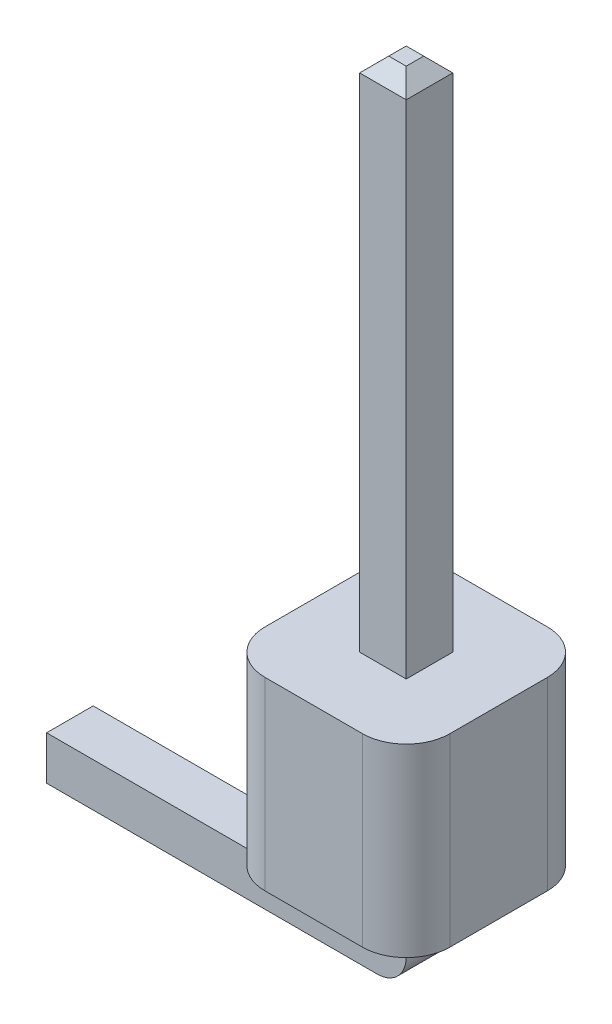
ISO-10303-21;
HEADER;
FILE_DESCRIPTION(('STEP AP214'),'2;1');
FILE_NAME('part.step','',(''),(''),'','','');
FILE_SCHEMA(('AUTOMOTIVE_DESIGN { 1 0 10303 214 1 1 1 1 }'));
ENDSEC;
DATA;
#1=APPLICATION_CONTEXT('core data for automotive mechanical design processes');
#2=APPLICATION_PROTOCOL_DEFINITION('international standard','automotive_design',2000,#1);
#3=PRODUCT_CONTEXT('',#1,'mechanical');
#4=PRODUCT('Part','Part','',(#3));
#5=PRODUCT_RELATED_PRODUCT_CATEGORY('part','',(#4));
#6=PRODUCT_DEFINITION_FORMATION('','',#4);
#7=PRODUCT_DEFINITION_CONTEXT('part definition',#1,'design');
#8=PRODUCT_DEFINITION('design','',#6,#7);
#9=PRODUCT_DEFINITION_SHAPE('','',#8);
#10=(LENGTH_UNIT() NAMED_UNIT(*) SI_UNIT(.MILLI.,.METRE.));
#11=(NAMED_UNIT(*) PLANE_ANGLE_UNIT() SI_UNIT($,.RADIAN.));
#12=(NAMED_UNIT(*) SI_UNIT($,.STERADIAN.) SOLID_ANGLE_UNIT());
#13=UNCERTAINTY_MEASURE_WITH_UNIT(LENGTH_MEASURE(1.E-05),#10,'distance_accuracy_value','');
#14=(GEOMETRIC_REPRESENTATION_CONTEXT(3) GLOBAL_UNCERTAINTY_ASSIGNED_CONTEXT((#13)) GLOBAL_UNIT_ASSIGNED_CONTEXT((#10,
#11,#12)) REPRESENTATION_CONTEXT('',''));
#15=CARTESIAN_POINT('',(0.,0.,0.));
#16=DIRECTION('',(0.,0.,1.));
#17=DIRECTION('',(1.,0.,0.));
#18=AXIS2_PLACEMENT_3D('',#15,#16,#17);
#19=CARTESIAN_POINT('',(-1.05381363281178,2.54,-1.51128201849815));
#20=DIRECTION('',(1.,0.,0.));
#21=DIRECTION('',(0.,0.,-1.));
#22=AXIS2_PLACEMENT_3D('',#19,#20,#21);
#23=PLANE('',#22);
#24=DIRECTION('',(0.,0.,1.));
#25=VECTOR('',#24,1.);
#26=CARTESIAN_POINT('',(-1.05381363281178,0.,-1.51128201849815));
#27=LINE('',#26,#25);
#28=CARTESIAN_POINT('',(-1.05381363281178,0.,-0.91128201849815));
#29=VERTEX_POINT('',#28);
#30=CARTESIAN_POINT('',(-1.05381363281178,0.,0.428717981501851));
#31=VERTEX_POINT('',#30);
#32=EDGE_CURVE('P0_E145',#29,#31,#27,.T.);
#33=ORIENTED_EDGE('',*,*,#32,.T.);
#34=DIRECTION('',(0.,-1.,0.));
#35=VECTOR('',#34,1.);
#36=CARTESIAN_POINT('',(-1.05381363281178,2.54,0.428717981501851));
#37=LINE('',#36,#35);
#38=CARTESIAN_POINT('',(-1.05381363281178,2.54,0.428717981501851));
#39=VERTEX_POINT('',#38);
#40=EDGE_CURVE('P0_E184',#31,#39,#37,.F.);
#41=ORIENTED_EDGE('',*,*,#40,.T.);
#42=DIRECTION('',(0.,0.,1.));
#43=VECTOR('',#42,1.);
#44=CARTESIAN_POINT('',(-1.05381363281178,2.54,-1.51128201849815));
#45=LINE('',#44,#43);
#46=CARTESIAN_POINT('',(-1.05381363281178,2.54,-0.91128201849815));
#47=VERTEX_POINT('',#46);
#48=EDGE_CURVE('P0_E149',#47,#39,#45,.T.);
#49=ORIENTED_EDGE('',*,*,#48,.F.);
#50=DIRECTION('',(0.,-1.,0.));
#51=VECTOR('',#50,1.);
#52=CARTESIAN_POINT('',(-1.05381363281178,2.54,-0.91128201849815));
#53=LINE('',#52,#51);
#54=EDGE_CURVE('P0_E160',#47,#29,#53,.T.);
#55=ORIENTED_EDGE('',*,*,#54,.T.);
#56=EDGE_LOOP('',(#33,#41,#49,#55));
#57=FACE_BOUND('',#56,.T.);
#58=ADVANCED_FACE('P0_F17',(#57),#23,.F.);
#59=CARTESIAN_POINT('',(-1.05381363281178,2.54,1.02871798150185));
#60=DIRECTION('',(0.,0.,-1.));
#61=DIRECTION('',(-1.,0.,0.));
#62=AXIS2_PLACEMENT_3D('',#59,#60,#61);
#63=PLANE('',#62);
#64=DIRECTION('',(1.,0.,0.));
#65=VECTOR('',#64,1.);
#66=CARTESIAN_POINT('',(-1.05381363281178,0.,1.02871798150185));
#67=LINE('',#66,#65);
#68=CARTESIAN_POINT('',(-0.453813632811776,0.,1.02871798150185));
#69=VERTEX_POINT('',#68);
#70=CARTESIAN_POINT('',(0.886186367188225,0.,1.02871798150185));
#71=VERTEX_POINT('',#70);
#72=EDGE_CURVE('P0_E163',#69,#71,#67,.T.);
#73=ORIENTED_EDGE('',*,*,#72,.T.);
#74=DIRECTION('',(0.,-1.,0.));
#75=VECTOR('',#74,1.);
#76=CARTESIAN_POINT('',(0.886186367188225,2.54,1.02871798150185));
#77=LINE('',#76,#75);
#78=CARTESIAN_POINT('',(0.886186367188225,2.54,1.02871798150185));
#79=VERTEX_POINT('',#78);
#80=EDGE_CURVE('P0_E193',#71,#79,#77,.F.);
#81=ORIENTED_EDGE('',*,*,#80,.T.);
#82=DIRECTION('',(1.,0.,0.));
#83=VECTOR('',#82,1.);
#84=CARTESIAN_POINT('',(-1.05381363281178,2.54,1.02871798150185));
#85=LINE('',#84,#83);
#86=CARTESIAN_POINT('',(-0.453813632811776,2.54,1.02871798150185));
#87=VERTEX_POINT('',#86);
#88=EDGE_CURVE('P0_E152',#87,#79,#85,.T.);
#89=ORIENTED_EDGE('',*,*,#88,.F.);
#90=DIRECTION('',(0.,-1.,0.));
#91=VECTOR('',#90,1.);
#92=CARTESIAN_POINT('',(-0.453813632811776,2.54,1.02871798150185));
#93=LINE('',#92,#91);
#94=EDGE_CURVE('P0_E179',#87,#69,#93,.T.);
#95=ORIENTED_EDGE('',*,*,#94,.T.);
#96=EDGE_LOOP('',(#73,#81,#89,#95));
#97=FACE_BOUND('',#96,.T.);
#98=ADVANCED_FACE('P0_F224',(#97),#63,.F.);
#99=CARTESIAN_POINT('',(1.48618636718822,2.54,-1.51128201849815));
#100=DIRECTION('',(-1.,0.,0.));
#101=DIRECTION('',(0.,0.,1.));
#102=AXIS2_PLACEMENT_3D('',#99,#100,#101);
#103=PLANE('',#102);
#104=DIRECTION('',(0.,0.,-1.));
#105=VECTOR('',#104,1.);
#106=CARTESIAN_POINT('',(1.48618636718822,0.,-1.51128201849815));
#107=LINE('',#106,#105);
#108=CARTESIAN_POINT('',(1.48618636718822,0.,0.428717981501851));
#109=VERTEX_POINT('',#108);
#110=CARTESIAN_POINT('',(1.48618636718822,0.,-0.91128201849815));
#111=VERTEX_POINT('',#110);
#112=EDGE_CURVE('P0_E166',#109,#111,#107,.T.);
#113=ORIENTED_EDGE('',*,*,#112,.T.);
#114=DIRECTION('',(0.,-1.,0.));
#115=VECTOR('',#114,1.);
#116=CARTESIAN_POINT('',(1.48618636718822,2.54,-0.91128201849815));
#117=LINE('',#116,#115);
#118=CARTESIAN_POINT('',(1.48618636718822,2.54,-0.91128201849815));
#119=VERTEX_POINT('',#118);
#120=EDGE_CURVE('P0_E25',#111,#119,#117,.F.);
#121=ORIENTED_EDGE('',*,*,#120,.T.);
#122=DIRECTION('',(0.,0.,-1.));
#123=VECTOR('',#122,1.);
#124=CARTESIAN_POINT('',(1.48618636718822,2.54,-1.51128201849815));
#125=LINE('',#124,#123);
#126=CARTESIAN_POINT('',(1.48618636718822,2.54,0.428717981501851));
#127=VERTEX_POINT('',#126);
#128=EDGE_CURVE('P0_E156',#127,#119,#125,.T.);
#129=ORIENTED_EDGE('',*,*,#128,.F.);
#130=DIRECTION('',(0.,-1.,0.));
#131=VECTOR('',#130,1.);
#132=CARTESIAN_POINT('',(1.48618636718822,2.54,0.428717981501851));
#133=LINE('',#132,#131);
#134=EDGE_CURVE('P0_E188',#127,#109,#133,.T.);
#135=ORIENTED_EDGE('',*,*,#134,.T.);
#136=EDGE_LOOP('',(#113,#121,#129,#135));
#137=FACE_BOUND('',#136,.T.);
#138=ADVANCED_FACE('P0_F230',(#137),#103,.F.);
#139=CARTESIAN_POINT('',(-1.05381363281178,2.54,-1.51128201849815));
#140=DIRECTION('',(0.,0.,1.));
#141=DIRECTION('',(1.,0.,0.));
#142=AXIS2_PLACEMENT_3D('',#139,#140,#141);
#143=PLANE('',#142);
#144=DIRECTION('',(-1.,0.,0.));
#145=VECTOR('',#144,1.);
#146=CARTESIAN_POINT('',(-1.05381363281178,2.54,-1.51128201849815));
#147=LINE('',#146,#145);
#148=CARTESIAN_POINT('',(0.886186367188225,2.54,-1.51128201849815));
#149=VERTEX_POINT('',#148);
#150=CARTESIAN_POINT('',(-0.453813632811776,2.54,-1.51128201849815));
#151=VERTEX_POINT('',#150);
#152=EDGE_CURVE('P0_E158',#149,#151,#147,.T.);
#153=ORIENTED_EDGE('',*,*,#152,.F.);
#154=DIRECTION('',(0.,-1.,0.));
#155=VECTOR('',#154,1.);
#156=CARTESIAN_POINT('',(0.886186367188225,2.54,-1.51128201849815));
#157=LINE('',#156,#155);
#158=CARTESIAN_POINT('',(0.886186367188225,0.,-1.51128201849815));
#159=VERTEX_POINT('',#158);
#160=EDGE_CURVE('P0_E197',#149,#159,#157,.T.);
#161=ORIENTED_EDGE('',*,*,#160,.T.);
#162=DIRECTION('',(-1.,0.,0.));
#163=VECTOR('',#162,1.);
#164=CARTESIAN_POINT('',(-1.05381363281178,0.,-1.51128201849815));
#165=LINE('',#164,#163);
#166=CARTESIAN_POINT('',(-0.453813632811776,0.,-1.51128201849815));
#167=VERTEX_POINT('',#166);
#168=EDGE_CURVE('P0_E153',#159,#167,#165,.T.);
#169=ORIENTED_EDGE('',*,*,#168,.T.);
#170=DIRECTION('',(0.,-1.,0.));
#171=VECTOR('',#170,1.);
#172=CARTESIAN_POINT('',(-0.453813632811776,2.54,-1.51128201849815));
#173=LINE('',#172,#171);
#174=EDGE_CURVE('P0_E174',#167,#151,#173,.F.);
#175=ORIENTED_EDGE('',*,*,#174,.T.);
#176=EDGE_LOOP('',(#153,#161,#169,#175));
#177=FACE_BOUND('',#176,.T.);
#178=ADVANCED_FACE('P0_F203',(#177),#143,.F.);
#179=CARTESIAN_POINT('',(0.,2.54,0.));
#180=DIRECTION('',(0.,1.,0.));
#181=DIRECTION('',(0.,0.,1.));
#182=AXIS2_PLACEMENT_3D('',#179,#180,#181);
#183=PLANE('',#182);
#184=DIRECTION('',(0.,0.,-1.));
#185=VECTOR('',#184,1.);
#186=CARTESIAN_POINT('',(0.536186367188225,2.54,0.0787179815018502));
#187=LINE('',#186,#185);
#188=CARTESIAN_POINT('',(0.536186367188225,2.54,0.0787179815018502));
#189=VERTEX_POINT('',#188);
#190=CARTESIAN_POINT('',(0.536186367188225,2.54,-0.56128201849815));
#191=VERTEX_POINT('',#190);
#192=EDGE_CURVE('P0_E113',#189,#191,#187,.T.);
#193=ORIENTED_EDGE('',*,*,#192,.F.);
#194=DIRECTION('',(1.,0.,0.));
#195=VECTOR('',#194,1.);
#196=CARTESIAN_POINT('',(-0.103813632811776,2.54,0.0787179815018502));
#197=LINE('',#196,#195);
#198=CARTESIAN_POINT('',(-0.103813632811776,2.54,0.0787179815018502));
#199=VERTEX_POINT('',#198);
#200=EDGE_CURVE('P0_E130',#199,#189,#197,.T.);
#201=ORIENTED_EDGE('',*,*,#200,.F.);
#202=DIRECTION('',(0.,0.,1.));
#203=VECTOR('',#202,1.);
#204=CARTESIAN_POINT('',(-0.103813632811776,2.54,0.0787179815018502));
#205=LINE('',#204,#203);
#206=CARTESIAN_POINT('',(-0.103813632811776,2.54,-0.56128201849815));
#207=VERTEX_POINT('',#206);
#208=EDGE_CURVE('P0_E133',#207,#199,#205,.T.);
#209=ORIENTED_EDGE('',*,*,#208,.F.);
#210=DIRECTION('',(-1.,0.,0.));
#211=VECTOR('',#210,1.);
#212=CARTESIAN_POINT('',(-0.103813632811776,2.54,-0.56128201849815));
#213=LINE('',#212,#211);
#214=EDGE_CURVE('P0_E139',#191,#207,#213,.T.);
#215=ORIENTED_EDGE('',*,*,#214,.F.);
#216=EDGE_LOOP('',(#193,#201,#209,#215));
#217=FACE_BOUND('',#216,.T.);
#218=ORIENTED_EDGE('',*,*,#128,.T.);
#219=CARTESIAN_POINT('',(0.886186367188225,2.54,-0.91128201849815));
#220=DIRECTION('',(0.,1.,0.));
#221=DIRECTION('',(0.,0.,1.));
#222=AXIS2_PLACEMENT_3D('',#219,#220,#221);
#223=CIRCLE('',#222,0.6);
#224=EDGE_CURVE('P0_E11',#119,#149,#223,.T.);
#225=ORIENTED_EDGE('',*,*,#224,.T.);
#226=ORIENTED_EDGE('',*,*,#152,.T.);
#227=CARTESIAN_POINT('',(-0.453813632811776,2.54,-0.91128201849815));
#228=DIRECTION('',(0.,1.,0.));
#229=DIRECTION('',(0.,0.,1.));
#230=AXIS2_PLACEMENT_3D('',#227,#228,#229);
#231=CIRCLE('',#230,0.6);
#232=EDGE_CURVE('P0_E177',#151,#47,#231,.T.);
#233=ORIENTED_EDGE('',*,*,#232,.T.);
#234=ORIENTED_EDGE('',*,*,#48,.T.);
#235=CARTESIAN_POINT('',(-0.453813632811776,2.54,0.428717981501851));
#236=DIRECTION('',(0.,1.,0.));
#237=DIRECTION('',(0.,0.,1.));
#238=AXIS2_PLACEMENT_3D('',#235,#236,#237);
#239=CIRCLE('',#238,0.6);
#240=EDGE_CURVE('P0_E186',#39,#87,#239,.T.);
#241=ORIENTED_EDGE('',*,*,#240,.T.);
#242=ORIENTED_EDGE('',*,*,#88,.T.);
#243=CARTESIAN_POINT('',(0.886186367188225,2.54,0.428717981501851));
#244=DIRECTION('',(0.,1.,0.));
#245=DIRECTION('',(0.,0.,1.));
#246=AXIS2_PLACEMENT_3D('',#243,#244,#245);
#247=CIRCLE('',#246,0.6);
#248=EDGE_CURVE('P0_E195',#79,#127,#247,.T.);
#249=ORIENTED_EDGE('',*,*,#248,.T.);
#250=EDGE_LOOP('',(#218,#225,#226,#233,#234,#241,#242,#249));
#251=FACE_BOUND('',#250,.T.);
#252=ADVANCED_FACE('P0_F214',(#217,#251),#183,.T.);
#253=CARTESIAN_POINT('',(0.,0.,0.));
#254=DIRECTION('',(0.,1.,0.));
#255=DIRECTION('',(0.,0.,1.));
#256=AXIS2_PLACEMENT_3D('',#253,#254,#255);
#257=PLANE('',#256);
#258=DIRECTION('',(1.,0.,0.));
#259=VECTOR('',#258,1.);
#260=CARTESIAN_POINT('',(-0.103813632811776,0.,0.0787179815018502));
#261=LINE('',#260,#259);
#262=CARTESIAN_POINT('',(-0.103813632811776,0.,0.0787179815018502));
#263=VERTEX_POINT('',#262);
#264=CARTESIAN_POINT('',(0.536186367188225,0.,0.0787179815018502));
#265=VERTEX_POINT('',#264);
#266=EDGE_CURVE('P0_E118',#263,#265,#261,.T.);
#267=ORIENTED_EDGE('',*,*,#266,.T.);
#268=DIRECTION('',(0.,0.,-1.));
#269=VECTOR('',#268,1.);
#270=CARTESIAN_POINT('',(0.536186367188225,0.,0.0787179815018502));
#271=LINE('',#270,#269);
#272=CARTESIAN_POINT('',(0.536186367188225,0.,-0.56128201849815));
#273=VERTEX_POINT('',#272);
#274=EDGE_CURVE('P0_E110',#265,#273,#271,.T.);
#275=ORIENTED_EDGE('',*,*,#274,.T.);
#276=DIRECTION('',(-1.,0.,0.));
#277=VECTOR('',#276,1.);
#278=CARTESIAN_POINT('',(-0.103813632811776,0.,-0.56128201849815));
#279=LINE('',#278,#277);
#280=CARTESIAN_POINT('',(-0.103813632811776,0.,-0.56128201849815));
#281=VERTEX_POINT('',#280);
#282=EDGE_CURVE('P0_E122',#273,#281,#279,.T.);
#283=ORIENTED_EDGE('',*,*,#282,.T.);
#284=DIRECTION('',(0.,0.,1.));
#285=VECTOR('',#284,1.);
#286=CARTESIAN_POINT('',(-0.103813632811776,0.,0.0787179815018502));
#287=LINE('',#286,#285);
#288=EDGE_CURVE('P0_E126',#281,#263,#287,.T.);
#289=ORIENTED_EDGE('',*,*,#288,.T.);
#290=EDGE_LOOP('',(#267,#275,#283,#289));
#291=FACE_BOUND('',#290,.T.);
#292=ORIENTED_EDGE('',*,*,#168,.F.);
#293=CARTESIAN_POINT('',(0.886186367188225,0.,-0.91128201849815));
#294=DIRECTION('',(0.,1.,0.));
#295=DIRECTION('',(0.,0.,1.));
#296=AXIS2_PLACEMENT_3D('',#293,#294,#295);
#297=CIRCLE('',#296,0.6);
#298=EDGE_CURVE('P0_E39',#159,#111,#297,.F.);
#299=ORIENTED_EDGE('',*,*,#298,.T.);
#300=ORIENTED_EDGE('',*,*,#112,.F.);
#301=CARTESIAN_POINT('',(0.886186367188225,0.,0.428717981501851));
#302=DIRECTION('',(0.,1.,0.));
#303=DIRECTION('',(0.,0.,1.));
#304=AXIS2_PLACEMENT_3D('',#301,#302,#303);
#305=CIRCLE('',#304,0.6);
#306=EDGE_CURVE('P0_E191',#109,#71,#305,.F.);
#307=ORIENTED_EDGE('',*,*,#306,.T.);
#308=ORIENTED_EDGE('',*,*,#72,.F.);
#309=CARTESIAN_POINT('',(-0.453813632811776,0.,0.428717981501851));
#310=DIRECTION('',(0.,1.,0.));
#311=DIRECTION('',(0.,0.,1.));
#312=AXIS2_PLACEMENT_3D('',#309,#310,#311);
#313=CIRCLE('',#312,0.6);
#314=EDGE_CURVE('P0_E182',#69,#31,#313,.F.);
#315=ORIENTED_EDGE('',*,*,#314,.T.);
#316=ORIENTED_EDGE('',*,*,#32,.F.);
#317=CARTESIAN_POINT('',(-0.453813632811776,0.,-0.91128201849815));
#318=DIRECTION('',(0.,1.,0.));
#319=DIRECTION('',(0.,0.,1.));
#320=AXIS2_PLACEMENT_3D('',#317,#318,#319);
#321=CIRCLE('',#320,0.6);
#322=EDGE_CURVE('P0_E171',#29,#167,#321,.F.);
#323=ORIENTED_EDGE('',*,*,#322,.T.);
#324=EDGE_LOOP('',(#292,#299,#300,#307,#308,#315,#316,#323));
#325=FACE_BOUND('',#324,.T.);
#326=ADVANCED_FACE('P0_F128',(#291,#325),#257,.F.);
#327=CARTESIAN_POINT('',(0.536186367188225,0.,0.0787179815018502));
#328=DIRECTION('',(1.,0.,0.));
#329=DIRECTION('',(0.,0.,-1.));
#330=AXIS2_PLACEMENT_3D('',#327,#328,#329);
#331=PLANE('',#330);
#332=ORIENTED_EDGE('',*,*,#192,.T.);
#333=DIRECTION('',(0.,1.,0.));
#334=VECTOR('',#333,1.);
#335=CARTESIAN_POINT('',(0.536186367188225,0.,-0.56128201849815));
#336=LINE('',#335,#334);
#337=EDGE_CURVE('P0_E106',#273,#191,#336,.T.);
#338=ORIENTED_EDGE('',*,*,#337,.F.);
#339=ORIENTED_EDGE('',*,*,#274,.F.);
#340=DIRECTION('',(0.,1.,0.));
#341=VECTOR('',#340,1.);
#342=CARTESIAN_POINT('',(0.536186367188225,0.,0.0787179815018502));
#343=LINE('',#342,#341);
#344=EDGE_CURVE('P0_E143',#265,#189,#343,.T.);
#345=ORIENTED_EDGE('',*,*,#344,.T.);
#346=EDGE_LOOP('',(#332,#338,#339,#345));
#347=FACE_BOUND('',#346,.T.);
#348=ADVANCED_FACE('P0_F108',(#347),#331,.F.);
#349=CARTESIAN_POINT('',(-0.103813632811776,0.,0.0787179815018502));
#350=DIRECTION('',(0.,0.,1.));
#351=DIRECTION('',(1.,0.,0.));
#352=AXIS2_PLACEMENT_3D('',#349,#350,#351);
#353=PLANE('',#352);
#354=ORIENTED_EDGE('',*,*,#200,.T.);
#355=ORIENTED_EDGE('',*,*,#344,.F.);
#356=ORIENTED_EDGE('',*,*,#266,.F.);
#357=DIRECTION('',(0.,1.,0.));
#358=VECTOR('',#357,1.);
#359=CARTESIAN_POINT('',(-0.103813632811776,0.,0.0787179815018502));
#360=LINE('',#359,#358);
#361=EDGE_CURVE('P0_E146',#263,#199,#360,.T.);
#362=ORIENTED_EDGE('',*,*,#361,.T.);
#363=EDGE_LOOP('',(#354,#355,#356,#362));
#364=FACE_BOUND('',#363,.T.);
#365=ADVANCED_FACE('P0_F320',(#364),#353,.F.);
#366=CARTESIAN_POINT('',(-0.103813632811776,0.,0.0787179815018502));
#367=DIRECTION('',(-1.,0.,0.));
#368=DIRECTION('',(0.,0.,1.));
#369=AXIS2_PLACEMENT_3D('',#366,#367,#368);
#370=PLANE('',#369);
#371=ORIENTED_EDGE('',*,*,#208,.T.);
#372=ORIENTED_EDGE('',*,*,#361,.F.);
#373=ORIENTED_EDGE('',*,*,#288,.F.);
#374=DIRECTION('',(0.,1.,0.));
#375=VECTOR('',#374,1.);
#376=CARTESIAN_POINT('',(-0.103813632811776,0.,-0.56128201849815));
#377=LINE('',#376,#375);
#378=EDGE_CURVE('P0_E117',#281,#207,#377,.T.);
#379=ORIENTED_EDGE('',*,*,#378,.T.);
#380=EDGE_LOOP('',(#371,#372,#373,#379));
#381=FACE_BOUND('',#380,.T.);
#382=ADVANCED_FACE('P0_F328',(#381),#370,.F.);
#383=CARTESIAN_POINT('',(-0.103813632811776,0.,-0.56128201849815));
#384=DIRECTION('',(0.,0.,-1.));
#385=DIRECTION('',(-1.,0.,0.));
#386=AXIS2_PLACEMENT_3D('',#383,#384,#385);
#387=PLANE('',#386);
#388=ORIENTED_EDGE('',*,*,#214,.T.);
#389=ORIENTED_EDGE('',*,*,#378,.F.);
#390=ORIENTED_EDGE('',*,*,#282,.F.);
#391=ORIENTED_EDGE('',*,*,#337,.T.);
#392=EDGE_LOOP('',(#388,#389,#390,#391));
#393=FACE_BOUND('',#392,.T.);
#394=ADVANCED_FACE('P0_F123',(#393),#387,.F.);
#395=CARTESIAN_POINT('',(-0.453813632811776,2.54,-0.91128201849815));
#396=DIRECTION('',(0.,-1.,0.));
#397=DIRECTION('',(0.,0.,-1.));
#398=AXIS2_PLACEMENT_3D('',#395,#396,#397);
#399=CYLINDRICAL_SURFACE('',#398,0.6);
#400=ORIENTED_EDGE('',*,*,#232,.F.);
#401=ORIENTED_EDGE('',*,*,#174,.F.);
#402=ORIENTED_EDGE('',*,*,#322,.F.);
#403=ORIENTED_EDGE('',*,*,#54,.F.);
#404=EDGE_LOOP('',(#400,#401,#402,#403));
#405=FACE_BOUND('',#404,.T.);
#406=ADVANCED_FACE('P0_F211',(#405),#399,.T.);
#407=CARTESIAN_POINT('',(-0.453813632811776,2.54,0.428717981501851));
#408=DIRECTION('',(0.,-1.,0.));
#409=DIRECTION('',(0.,0.,-1.));
#410=AXIS2_PLACEMENT_3D('',#407,#408,#409);
#411=CYLINDRICAL_SURFACE('',#410,0.6);
#412=ORIENTED_EDGE('',*,*,#240,.F.);
#413=ORIENTED_EDGE('',*,*,#40,.F.);
#414=ORIENTED_EDGE('',*,*,#314,.F.);
#415=ORIENTED_EDGE('',*,*,#94,.F.);
#416=EDGE_LOOP('',(#412,#413,#414,#415));
#417=FACE_BOUND('',#416,.T.);
#418=ADVANCED_FACE('P0_F219',(#417),#411,.T.);
#419=CARTESIAN_POINT('',(0.886186367188225,2.54,0.428717981501851));
#420=DIRECTION('',(0.,-1.,0.));
#421=DIRECTION('',(0.,0.,-1.));
#422=AXIS2_PLACEMENT_3D('',#419,#420,#421);
#423=CYLINDRICAL_SURFACE('',#422,0.6);
#424=ORIENTED_EDGE('',*,*,#248,.F.);
#425=ORIENTED_EDGE('',*,*,#80,.F.);
#426=ORIENTED_EDGE('',*,*,#306,.F.);
#427=ORIENTED_EDGE('',*,*,#134,.F.);
#428=EDGE_LOOP('',(#424,#425,#426,#427));
#429=FACE_BOUND('',#428,.T.);
#430=ADVANCED_FACE('P0_F228',(#429),#423,.T.);
#431=CARTESIAN_POINT('',(0.886186367188225,2.54,-0.91128201849815));
#432=DIRECTION('',(0.,-1.,0.));
#433=DIRECTION('',(0.,0.,-1.));
#434=AXIS2_PLACEMENT_3D('',#431,#432,#433);
#435=CYLINDRICAL_SURFACE('',#434,0.6);
#436=ORIENTED_EDGE('',*,*,#224,.F.);
#437=ORIENTED_EDGE('',*,*,#120,.F.);
#438=ORIENTED_EDGE('',*,*,#298,.F.);
#439=ORIENTED_EDGE('',*,*,#160,.F.);
#440=EDGE_LOOP('',(#436,#437,#438,#439));
#441=FACE_BOUND('',#440,.T.);
#442=ADVANCED_FACE('P0_F19',(#441),#435,.T.);
#443=CLOSED_SHELL('',(#58,#98,#138,#178,#252,#326,#348,#365,#382,#394,#406,#418,#430,#442));
#444=MANIFOLD_SOLID_BREP('P0_B1',#443);
#445=CARTESIAN_POINT('',(-0.103813632811776,9.63061706383388,-0.56128201849815));
#446=DIRECTION('',(1.,0.,0.));
#447=DIRECTION('',(0.,0.,-1.));
#448=AXIS2_PLACEMENT_3D('',#445,#446,#447);
#449=PLANE('',#448);
#450=DIRECTION('',(0.,-1.,0.));
#451=VECTOR('',#450,1.);
#452=CARTESIAN_POINT('',(-0.103813632811776,9.63061706383388,-0.56128201849815));
#453=LINE('',#452,#451);
#454=CARTESIAN_POINT('',(-0.103813632811776,9.43061706383388,-0.56128201849815));
#455=VERTEX_POINT('',#454);
#456=CARTESIAN_POINT('',(-0.103813632811776,-0.169382936166121,-0.56128201849815));
#457=VERTEX_POINT('',#456);
#458=EDGE_CURVE('P1_E125',#455,#457,#453,.T.);
#459=ORIENTED_EDGE('',*,*,#458,.T.);
#460=DIRECTION('',(0.,0.,-1.));
#461=VECTOR('',#460,1.);
#462=CARTESIAN_POINT('',(-0.103813632811776,-0.16938293616612,0.0787179815018501));
#463=LINE('',#462,#461);
#464=CARTESIAN_POINT('',(-0.103813632811776,-0.169382936166121,0.0787179815018501));
#465=VERTEX_POINT('',#464);
#466=EDGE_CURVE('P1_E192',#457,#465,#463,.F.);
#467=ORIENTED_EDGE('',*,*,#466,.T.);
#468=DIRECTION('',(0.,-1.,0.));
#469=VECTOR('',#468,1.);
#470=CARTESIAN_POINT('',(-0.103813632811776,9.63061706383388,0.0787179815018501));
#471=LINE('',#470,#469);
#472=CARTESIAN_POINT('',(-0.103813632811776,9.43061706383388,0.0787179815018501));
#473=VERTEX_POINT('',#472);
#474=EDGE_CURVE('P1_E131',#473,#465,#471,.T.);
#475=ORIENTED_EDGE('',*,*,#474,.F.);
#476=DIRECTION('',(0.,0.,-1.));
#477=VECTOR('',#476,1.);
#478=CARTESIAN_POINT('',(-0.103813632811776,9.43061706383388,-0.56128201849815));
#479=LINE('',#478,#477);
#480=EDGE_CURVE('P1_E146',#473,#455,#479,.T.);
#481=ORIENTED_EDGE('',*,*,#480,.T.);
#482=EDGE_LOOP('',(#459,#467,#475,#481));
#483=FACE_BOUND('',#482,.T.);
#484=ADVANCED_FACE('P1_F16',(#483),#449,.F.);
#485=CARTESIAN_POINT('',(-0.103813632811776,9.63061706383388,0.0787179815018501));
#486=DIRECTION('',(0.,0.,-1.));
#487=DIRECTION('',(-1.,0.,0.));
#488=AXIS2_PLACEMENT_3D('',#485,#486,#487);
#489=PLANE('',#488);
#490=DIRECTION('',(1.,0.,0.));
#491=VECTOR('',#490,1.);
#492=CARTESIAN_POINT('',(-4.60381363281178,-0.569382936166121,0.0787179815018501));
#493=LINE('',#492,#491);
#494=CARTESIAN_POINT('',(-4.40381363281177,-0.569382936166121,0.0787179815018501));
#495=VERTEX_POINT('',#494);
#496=CARTESIAN_POINT('',(-0.503813632811776,-0.569382936166121,0.0787179815018501));
#497=VERTEX_POINT('',#496);
#498=EDGE_CURVE('P1_E154',#495,#497,#493,.T.);
#499=ORIENTED_EDGE('',*,*,#498,.F.);
#500=DIRECTION('',(0.,-1.,0.));
#501=VECTOR('',#500,1.);
#502=CARTESIAN_POINT('',(-4.40381363281177,-1.16938293616612,0.0787179815018501));
#503=LINE('',#502,#501);
#504=CARTESIAN_POINT('',(-4.40381363281177,-1.16938293616612,0.0787179815018501));
#505=VERTEX_POINT('',#504);
#506=EDGE_CURVE('P1_E10',#495,#505,#503,.T.);
#507=ORIENTED_EDGE('',*,*,#506,.T.);
#508=DIRECTION('',(1.,0.,0.));
#509=VECTOR('',#508,1.);
#510=CARTESIAN_POINT('',(-4.60381363281178,-1.16938293616612,0.0787179815018501));
#511=LINE('',#510,#509);
#512=CARTESIAN_POINT('',(0.136186367188224,-1.16938293616612,0.0787179815018501));
#513=VERTEX_POINT('',#512);
#514=EDGE_CURVE('P1_E212',#505,#513,#511,.T.);
#515=ORIENTED_EDGE('',*,*,#514,.T.);
#516=CARTESIAN_POINT('',(0.136186367188224,-0.769382936166121,0.0787179815018501));
#517=DIRECTION('',(0.,0.,-1.));
#518=DIRECTION('',(-1.,0.,0.));
#519=AXIS2_PLACEMENT_3D('',#516,#517,#518);
#520=CIRCLE('',#519,0.4);
#521=CARTESIAN_POINT('',(0.536186367188224,-0.769382936166121,0.0787179815018501));
#522=VERTEX_POINT('',#521);
#523=EDGE_CURVE('P1_E176',#513,#522,#520,.F.);
#524=ORIENTED_EDGE('',*,*,#523,.T.);
#525=DIRECTION('',(0.,-1.,0.));
#526=VECTOR('',#525,1.);
#527=CARTESIAN_POINT('',(0.536186367188224,9.63061706383388,0.0787179815018501));
#528=LINE('',#527,#526);
#529=CARTESIAN_POINT('',(0.536186367188224,9.43061706383388,0.0787179815018501));
#530=VERTEX_POINT('',#529);
#531=EDGE_CURVE('P1_E134',#530,#522,#528,.T.);
#532=ORIENTED_EDGE('',*,*,#531,.F.);
#533=DIRECTION('',(-1.,0.,0.));
#534=VECTOR('',#533,1.);
#535=CARTESIAN_POINT('',(-0.103813632811776,9.43061706383388,0.0787179815018501));
#536=LINE('',#535,#534);
#537=EDGE_CURVE('P1_E122',#530,#473,#536,.T.);
#538=ORIENTED_EDGE('',*,*,#537,.T.);
#539=ORIENTED_EDGE('',*,*,#474,.T.);
#540=CARTESIAN_POINT('',(-0.503813632811776,-0.16938293616612,0.0787179815018501));
#541=DIRECTION('',(0.,0.,-1.));
#542=DIRECTION('',(-1.,0.,0.));
#543=AXIS2_PLACEMENT_3D('',#540,#541,#542);
#544=CIRCLE('',#543,0.4);
#545=EDGE_CURVE('P1_E196',#465,#497,#544,.T.);
#546=ORIENTED_EDGE('',*,*,#545,.T.);
#547=EDGE_LOOP('',(#499,#507,#515,#524,#532,#538,#539,#546));
#548=FACE_BOUND('',#547,.T.);
#549=ADVANCED_FACE('P1_F244',(#548),#489,.F.);
#550=CARTESIAN_POINT('',(0.536186367188224,9.63061706383388,-0.56128201849815));
#551=DIRECTION('',(-1.,0.,0.));
#552=DIRECTION('',(0.,0.,1.));
#553=AXIS2_PLACEMENT_3D('',#550,#551,#552);
#554=PLANE('',#553);
#555=ORIENTED_EDGE('',*,*,#531,.T.);
#556=DIRECTION('',(0.,0.,-1.));
#557=VECTOR('',#556,1.);
#558=CARTESIAN_POINT('',(0.536186367188224,-0.769382936166121,-0.56128201849815));
#559=LINE('',#558,#557);
#560=CARTESIAN_POINT('',(0.536186367188224,-0.769382936166121,-0.56128201849815));
#561=VERTEX_POINT('',#560);
#562=EDGE_CURVE('P1_E151',#522,#561,#559,.T.);
#563=ORIENTED_EDGE('',*,*,#562,.T.);
#564=DIRECTION('',(0.,-1.,0.));
#565=VECTOR('',#564,1.);
#566=CARTESIAN_POINT('',(0.536186367188224,9.63061706383388,-0.56128201849815));
#567=LINE('',#566,#565);
#568=CARTESIAN_POINT('',(0.536186367188224,9.43061706383388,-0.56128201849815));
#569=VERTEX_POINT('',#568);
#570=EDGE_CURVE('P1_E159',#569,#561,#567,.T.);
#571=ORIENTED_EDGE('',*,*,#570,.F.);
#572=DIRECTION('',(0.,0.,1.));
#573=VECTOR('',#572,1.);
#574=CARTESIAN_POINT('',(0.536186367188224,9.43061706383388,0.0787179815018501));
#575=LINE('',#574,#573);
#576=EDGE_CURVE('P1_E149',#569,#530,#575,.T.);
#577=ORIENTED_EDGE('',*,*,#576,.T.);
#578=EDGE_LOOP('',(#555,#563,#571,#577));
#579=FACE_BOUND('',#578,.T.);
#580=ADVANCED_FACE('P1_F169',(#579),#554,.F.);
#581=CARTESIAN_POINT('',(-0.103813632811776,9.63061706383388,-0.56128201849815));
#582=DIRECTION('',(0.,0.,1.));
#583=DIRECTION('',(1.,0.,0.));
#584=AXIS2_PLACEMENT_3D('',#581,#582,#583);
#585=PLANE('',#584);
#586=DIRECTION('',(1.,0.,0.));
#587=VECTOR('',#586,1.);
#588=CARTESIAN_POINT('',(-4.60381363281178,-1.16938293616612,-0.56128201849815));
#589=LINE('',#588,#587);
#590=CARTESIAN_POINT('',(-4.40381363281177,-1.16938293616612,-0.56128201849815));
#591=VERTEX_POINT('',#590);
#592=CARTESIAN_POINT('',(0.136186367188224,-1.16938293616612,-0.56128201849815));
#593=VERTEX_POINT('',#592);
#594=EDGE_CURVE('P1_E209',#591,#593,#589,.T.);
#595=ORIENTED_EDGE('',*,*,#594,.F.);
#596=DIRECTION('',(0.,1.,0.));
#597=VECTOR('',#596,1.);
#598=CARTESIAN_POINT('',(-4.40381363281177,-0.569382936166121,-0.56128201849815));
#599=LINE('',#598,#597);
#600=CARTESIAN_POINT('',(-4.40381363281177,-0.569382936166121,-0.56128201849815));
#601=VERTEX_POINT('',#600);
#602=EDGE_CURVE('P1_E40',#591,#601,#599,.T.);
#603=ORIENTED_EDGE('',*,*,#602,.T.);
#604=DIRECTION('',(1.,0.,0.));
#605=VECTOR('',#604,1.);
#606=CARTESIAN_POINT('',(-4.60381363281178,-0.569382936166121,-0.56128201849815));
#607=LINE('',#606,#605);
#608=CARTESIAN_POINT('',(-0.503813632811776,-0.569382936166121,-0.56128201849815));
#609=VERTEX_POINT('',#608);
#610=EDGE_CURVE('P1_E211',#601,#609,#607,.T.);
#611=ORIENTED_EDGE('',*,*,#610,.T.);
#612=CARTESIAN_POINT('',(-0.503813632811776,-0.16938293616612,-0.56128201849815));
#613=DIRECTION('',(0.,0.,1.));
#614=DIRECTION('',(1.,0.,0.));
#615=AXIS2_PLACEMENT_3D('',#612,#613,#614);
#616=CIRCLE('',#615,0.4);
#617=EDGE_CURVE('P1_E194',#609,#457,#616,.T.);
#618=ORIENTED_EDGE('',*,*,#617,.T.);
#619=ORIENTED_EDGE('',*,*,#458,.F.);
#620=DIRECTION('',(1.,0.,0.));
#621=VECTOR('',#620,1.);
#622=CARTESIAN_POINT('',(0.536186367188224,9.43061706383388,-0.56128201849815));
#623=LINE('',#622,#621);
#624=EDGE_CURVE('P1_E143',#455,#569,#623,.T.);
#625=ORIENTED_EDGE('',*,*,#624,.T.);
#626=ORIENTED_EDGE('',*,*,#570,.T.);
#627=CARTESIAN_POINT('',(0.136186367188224,-0.769382936166121,-0.56128201849815));
#628=DIRECTION('',(0.,0.,1.));
#629=DIRECTION('',(1.,0.,0.));
#630=AXIS2_PLACEMENT_3D('',#627,#628,#629);
#631=CIRCLE('',#630,0.4);
#632=EDGE_CURVE('P1_E178',#561,#593,#631,.F.);
#633=ORIENTED_EDGE('',*,*,#632,.T.);
#634=EDGE_LOOP('',(#595,#603,#611,#618,#619,#625,#626,#633));
#635=FACE_BOUND('',#634,.T.);
#636=ADVANCED_FACE('P1_F361',(#635),#585,.F.);
#637=CARTESIAN_POINT('',(4.60083619609739,9.63061706383388,5.80629884633454));
#638=DIRECTION('',(0.,1.,0.));
#639=DIRECTION('',(0.,0.,1.));
#640=AXIS2_PLACEMENT_3D('',#637,#638,#639);
#641=PLANE('',#640);
#642=DIRECTION('',(0.,0.,-1.));
#643=VECTOR('',#642,1.);
#644=CARTESIAN_POINT('',(0.336186367188222,9.63061706383388,-0.56128201849815));
#645=LINE('',#644,#643);
#646=CARTESIAN_POINT('',(0.336186367188222,9.63061706383388,-0.121282018498152));
#647=VERTEX_POINT('',#646);
#648=CARTESIAN_POINT('',(0.336186367188222,9.63061706383388,-0.361282018498148));
#649=VERTEX_POINT('',#648);
#650=EDGE_CURVE('P1_E110',#647,#649,#645,.T.);
#651=ORIENTED_EDGE('',*,*,#650,.T.);
#652=DIRECTION('',(-1.,0.,0.));
#653=VECTOR('',#652,1.);
#654=CARTESIAN_POINT('',(-0.103813632811776,9.63061706383388,-0.361282018498148));
#655=LINE('',#654,#653);
#656=CARTESIAN_POINT('',(0.0961863671882267,9.63061706383388,-0.361282018498148));
#657=VERTEX_POINT('',#656);
#658=EDGE_CURVE('P1_E141',#649,#657,#655,.T.);
#659=ORIENTED_EDGE('',*,*,#658,.T.);
#660=DIRECTION('',(0.,0.,1.));
#661=VECTOR('',#660,1.);
#662=CARTESIAN_POINT('',(0.0961863671882267,9.63061706383388,0.0787179815018501));
#663=LINE('',#662,#661);
#664=CARTESIAN_POINT('',(0.0961863671882267,9.63061706383388,-0.121282018498152));
#665=VERTEX_POINT('',#664);
#666=EDGE_CURVE('P1_E113',#657,#665,#663,.T.);
#667=ORIENTED_EDGE('',*,*,#666,.T.);
#668=DIRECTION('',(1.,0.,0.));
#669=VECTOR('',#668,1.);
#670=CARTESIAN_POINT('',(0.536186367188224,9.63061706383388,-0.121282018498152));
#671=LINE('',#670,#669);
#672=EDGE_CURVE('P1_E105',#665,#647,#671,.T.);
#673=ORIENTED_EDGE('',*,*,#672,.T.);
#674=EDGE_LOOP('',(#651,#659,#667,#673));
#675=FACE_BOUND('',#674,.T.);
#676=ADVANCED_FACE('P1_F107',(#675),#641,.T.);
#677=CARTESIAN_POINT('',(4.60083619609739,9.63061706383388,-0.121282018498152));
#678=DIRECTION('',(0.,0.707106781186547,0.707106781186547));
#679=DIRECTION('',(-1.,0.,0.));
#680=AXIS2_PLACEMENT_3D('',#677,#678,#679);
#681=PLANE('',#680);
#682=DIRECTION('',(-0.577350269189626,-0.577350269189626,0.577350269189626));
#683=VECTOR('',#682,1.);
#684=CARTESIAN_POINT('',(1.59773631015795,11.1321670068036,-1.62283196146787));
#685=LINE('',#684,#683);
#686=EDGE_CURVE('P1_E126',#473,#665,#685,.F.);
#687=ORIENTED_EDGE('',*,*,#686,.F.);
#688=ORIENTED_EDGE('',*,*,#537,.F.);
#689=DIRECTION('',(0.577350269189626,-0.577350269189626,0.577350269189626));
#690=VECTOR('',#689,1.);
#691=CARTESIAN_POINT('',(2.31204665546579,7.65475677555632,1.85457826977941));
#692=LINE('',#691,#690);
#693=EDGE_CURVE('P1_E120',#647,#530,#692,.T.);
#694=ORIENTED_EDGE('',*,*,#693,.F.);
#695=ORIENTED_EDGE('',*,*,#672,.F.);
#696=EDGE_LOOP('',(#687,#688,#694,#695));
#697=FACE_BOUND('',#696,.T.);
#698=ADVANCED_FACE('P1_F121',(#697),#681,.T.);
#699=CARTESIAN_POINT('',(0.336186367188222,9.63061706383388,5.80629884633454));
#700=DIRECTION('',(0.707106781186547,0.707106781186547,0.));
#701=DIRECTION('',(0.,0.,1.));
#702=AXIS2_PLACEMENT_3D('',#699,#700,#701);
#703=PLANE('',#702);
#704=ORIENTED_EDGE('',*,*,#693,.T.);
#705=ORIENTED_EDGE('',*,*,#576,.F.);
#706=DIRECTION('',(-0.577350269189626,0.577350269189626,0.577350269189626));
#707=VECTOR('',#706,1.);
#708=CARTESIAN_POINT('',(-1.71967392108934,11.6864773521114,1.69457826977941));
#709=LINE('',#708,#707);
#710=EDGE_CURVE('P1_E129',#649,#569,#709,.F.);
#711=ORIENTED_EDGE('',*,*,#710,.F.);
#712=ORIENTED_EDGE('',*,*,#650,.F.);
#713=EDGE_LOOP('',(#704,#705,#711,#712));
#714=FACE_BOUND('',#713,.T.);
#715=ADVANCED_FACE('P1_F128',(#714),#703,.T.);
#716=CARTESIAN_POINT('',(0.0961863671882267,9.63061706383388,5.80629884633454));
#717=DIRECTION('',(-0.707106781186547,0.707106781186547,0.));
#718=DIRECTION('',(0.,0.,-1.));
#719=AXIS2_PLACEMENT_3D('',#716,#717,#718);
#720=PLANE('',#719);
#721=ORIENTED_EDGE('',*,*,#686,.T.);
#722=ORIENTED_EDGE('',*,*,#666,.F.);
#723=DIRECTION('',(-0.577350269189626,-0.577350269189626,-0.577350269189626));
#724=VECTOR('',#723,1.);
#725=CARTESIAN_POINT('',(2.15204665546579,11.6864773521114,1.69457826977941));
#726=LINE('',#725,#724);
#727=EDGE_CURVE('P1_E152',#455,#657,#726,.F.);
#728=ORIENTED_EDGE('',*,*,#727,.F.);
#729=ORIENTED_EDGE('',*,*,#480,.F.);
#730=EDGE_LOOP('',(#721,#722,#728,#729));
#731=FACE_BOUND('',#730,.T.);
#732=ADVANCED_FACE('P1_F276',(#731),#720,.T.);
#733=CARTESIAN_POINT('',(4.60083619609739,9.63061706383388,-0.361282018498148));
#734=DIRECTION('',(0.,0.707106781186547,-0.707106781186547));
#735=DIRECTION('',(1.,0.,0.));
#736=AXIS2_PLACEMENT_3D('',#733,#734,#735);
#737=PLANE('',#736);
#738=ORIENTED_EDGE('',*,*,#710,.T.);
#739=ORIENTED_EDGE('',*,*,#624,.F.);
#740=ORIENTED_EDGE('',*,*,#727,.T.);
#741=ORIENTED_EDGE('',*,*,#658,.F.);
#742=EDGE_LOOP('',(#738,#739,#740,#741));
#743=FACE_BOUND('',#742,.T.);
#744=ADVANCED_FACE('P1_F273',(#743),#737,.T.);
#745=CARTESIAN_POINT('',(-4.60381363281178,-0.569382936166121,-0.56128201849815));
#746=DIRECTION('',(0.,-1.,0.));
#747=DIRECTION('',(0.,0.,-1.));
#748=AXIS2_PLACEMENT_3D('',#745,#746,#747);
#749=PLANE('',#748);
#750=ORIENTED_EDGE('',*,*,#610,.F.);
#751=DIRECTION('',(0.,0.,1.));
#752=VECTOR('',#751,1.);
#753=CARTESIAN_POINT('',(-4.40381363281177,-0.569382936166121,0.0787179815018501));
#754=LINE('',#753,#752);
#755=EDGE_CURVE('P1_E25',#601,#495,#754,.T.);
#756=ORIENTED_EDGE('',*,*,#755,.T.);
#757=ORIENTED_EDGE('',*,*,#498,.T.);
#758=DIRECTION('',(0.,0.,-1.));
#759=VECTOR('',#758,1.);
#760=CARTESIAN_POINT('',(-0.503813632811776,-0.569382936166121,-0.56128201849815));
#761=LINE('',#760,#759);
#762=EDGE_CURVE('P1_E189',#497,#609,#761,.T.);
#763=ORIENTED_EDGE('',*,*,#762,.T.);
#764=EDGE_LOOP('',(#750,#756,#757,#763));
#765=FACE_BOUND('',#764,.T.);
#766=ADVANCED_FACE('P1_F262',(#765),#749,.F.);
#767=CARTESIAN_POINT('',(-4.60381363281178,-1.16938293616612,-0.56128201849815));
#768=DIRECTION('',(0.,1.,0.));
#769=DIRECTION('',(0.,0.,1.));
#770=AXIS2_PLACEMENT_3D('',#767,#768,#769);
#771=PLANE('',#770);
#772=ORIENTED_EDGE('',*,*,#514,.F.);
#773=DIRECTION('',(0.,0.,-1.));
#774=VECTOR('',#773,1.);
#775=CARTESIAN_POINT('',(-4.40381363281177,-1.16938293616612,-0.56128201849815));
#776=LINE('',#775,#774);
#777=EDGE_CURVE('P1_E208',#505,#591,#776,.T.);
#778=ORIENTED_EDGE('',*,*,#777,.T.);
#779=ORIENTED_EDGE('',*,*,#594,.T.);
#780=DIRECTION('',(0.,0.,-1.));
#781=VECTOR('',#780,1.);
#782=CARTESIAN_POINT('',(0.136186367188224,-1.16938293616612,-0.56128201849815));
#783=LINE('',#782,#781);
#784=EDGE_CURVE('P1_E180',#593,#513,#783,.F.);
#785=ORIENTED_EDGE('',*,*,#784,.T.);
#786=EDGE_LOOP('',(#772,#778,#779,#785));
#787=FACE_BOUND('',#786,.T.);
#788=ADVANCED_FACE('P1_F247',(#787),#771,.F.);
#789=CARTESIAN_POINT('',(-4.60381363281178,-5.36938293616612,5.80629884633454));
#790=DIRECTION('',(-1.,0.,0.));
#791=DIRECTION('',(0.,0.,1.));
#792=AXIS2_PLACEMENT_3D('',#789,#790,#791);
#793=PLANE('',#792);
#794=DIRECTION('',(0.,-1.,0.));
#795=VECTOR('',#794,1.);
#796=CARTESIAN_POINT('',(-4.60381363281178,-1.16938293616612,-0.361282018498149));
#797=LINE('',#796,#795);
#798=CARTESIAN_POINT('',(-4.60381363281178,-0.769382936166121,-0.361282018498149));
#799=VERTEX_POINT('',#798);
#800=CARTESIAN_POINT('',(-4.60381363281178,-0.96938293616612,-0.361282018498149));
#801=VERTEX_POINT('',#800);
#802=EDGE_CURVE('P1_E203',#799,#801,#797,.T.);
#803=ORIENTED_EDGE('',*,*,#802,.T.);
#804=DIRECTION('',(0.,0.,1.));
#805=VECTOR('',#804,1.);
#806=CARTESIAN_POINT('',(-4.60381363281178,-0.96938293616612,0.0787179815018501));
#807=LINE('',#806,#805);
#808=CARTESIAN_POINT('',(-4.60381363281178,-0.96938293616612,-0.12128201849815));
#809=VERTEX_POINT('',#808);
#810=EDGE_CURVE('P1_E205',#801,#809,#807,.T.);
#811=ORIENTED_EDGE('',*,*,#810,.T.);
#812=DIRECTION('',(0.,1.,0.));
#813=VECTOR('',#812,1.);
#814=CARTESIAN_POINT('',(-4.60381363281178,-0.569382936166121,-0.12128201849815));
#815=LINE('',#814,#813);
#816=CARTESIAN_POINT('',(-4.60381363281178,-0.769382936166121,-0.12128201849815));
#817=VERTEX_POINT('',#816);
#818=EDGE_CURVE('P1_E199',#809,#817,#815,.T.);
#819=ORIENTED_EDGE('',*,*,#818,.T.);
#820=DIRECTION('',(0.,0.,-1.));
#821=VECTOR('',#820,1.);
#822=CARTESIAN_POINT('',(-4.60381363281178,-0.769382936166121,-0.56128201849815));
#823=LINE('',#822,#821);
#824=EDGE_CURVE('P1_E201',#817,#799,#823,.T.);
#825=ORIENTED_EDGE('',*,*,#824,.T.);
#826=EDGE_LOOP('',(#803,#811,#819,#825));
#827=FACE_BOUND('',#826,.T.);
#828=ADVANCED_FACE('P1_F252',(#827),#793,.T.);
#829=CARTESIAN_POINT('',(0.136186367188224,-0.769382936166121,-0.56128201849815));
#830=DIRECTION('',(0.,0.,-1.));
#831=DIRECTION('',(-1.,0.,0.));
#832=AXIS2_PLACEMENT_3D('',#829,#830,#831);
#833=CYLINDRICAL_SURFACE('',#832,0.4);
#834=ORIENTED_EDGE('',*,*,#523,.F.);
#835=ORIENTED_EDGE('',*,*,#784,.F.);
#836=ORIENTED_EDGE('',*,*,#632,.F.);
#837=ORIENTED_EDGE('',*,*,#562,.F.);
#838=EDGE_LOOP('',(#834,#835,#836,#837));
#839=FACE_BOUND('',#838,.T.);
#840=ADVANCED_FACE('P1_F174',(#839),#833,.T.);
#841=CARTESIAN_POINT('',(-0.503813632811776,-0.16938293616612,-0.56128201849815));
#842=DIRECTION('',(0.,0.,1.));
#843=DIRECTION('',(1.,0.,0.));
#844=AXIS2_PLACEMENT_3D('',#841,#842,#843);
#845=CYLINDRICAL_SURFACE('',#844,0.4);
#846=ORIENTED_EDGE('',*,*,#545,.F.);
#847=ORIENTED_EDGE('',*,*,#466,.F.);
#848=ORIENTED_EDGE('',*,*,#617,.F.);
#849=ORIENTED_EDGE('',*,*,#762,.F.);
#850=EDGE_LOOP('',(#846,#847,#848,#849));
#851=FACE_BOUND('',#850,.T.);
#852=ADVANCED_FACE('P1_F260',(#851),#845,.F.);
#853=CARTESIAN_POINT('',(-4.60381363281178,-0.769382936166121,5.80629884633454));
#854=DIRECTION('',(-0.707106781186544,0.707106781186551,0.));
#855=DIRECTION('',(0.,0.,1.));
#856=AXIS2_PLACEMENT_3D('',#853,#854,#855);
#857=PLANE('',#856);
#858=DIRECTION('',(-0.577350269189629,-0.577350269189624,-0.577350269189624));
#859=VECTOR('',#858,1.);
#860=CARTESIAN_POINT('',(-6.13714696614511,-2.30271626949944,-1.65461535183147));
#861=LINE('',#860,#859);
#862=EDGE_CURVE('P1_E226',#495,#817,#861,.T.);
#863=ORIENTED_EDGE('',*,*,#862,.F.);
#864=ORIENTED_EDGE('',*,*,#755,.F.);
#865=DIRECTION('',(-0.577350269189629,-0.577350269189624,0.577350269189624));
#866=VECTOR('',#865,1.);
#867=CARTESIAN_POINT('',(-6.65967392108934,-2.82524322444367,1.6945782697794));
#868=LINE('',#867,#866);
#869=EDGE_CURVE('P1_E20',#799,#601,#868,.F.);
#870=ORIENTED_EDGE('',*,*,#869,.F.);
#871=ORIENTED_EDGE('',*,*,#824,.F.);
#872=EDGE_LOOP('',(#863,#864,#870,#871));
#873=FACE_BOUND('',#872,.T.);
#874=ADVANCED_FACE('P1_F18',(#873),#857,.T.);
#875=CARTESIAN_POINT('',(-4.60381363281178,-5.36938293616612,-0.361282018498149));
#876=DIRECTION('',(-0.707106781186544,0.,-0.707106781186551));
#877=DIRECTION('',(0.,1.,0.));
#878=AXIS2_PLACEMENT_3D('',#875,#876,#877);
#879=PLANE('',#878);
#880=ORIENTED_EDGE('',*,*,#869,.T.);
#881=ORIENTED_EDGE('',*,*,#602,.F.);
#882=DIRECTION('',(-0.577350269189629,0.577350269189624,0.577350269189624));
#883=VECTOR('',#882,1.);
#884=CARTESIAN_POINT('',(-3.13714696614511,-2.43604960283278,-1.82794868516481));
#885=LINE('',#884,#883);
#886=EDGE_CURVE('P1_E225',#801,#591,#885,.F.);
#887=ORIENTED_EDGE('',*,*,#886,.F.);
#888=ORIENTED_EDGE('',*,*,#802,.F.);
#889=EDGE_LOOP('',(#880,#881,#887,#888));
#890=FACE_BOUND('',#889,.T.);
#891=ADVANCED_FACE('P1_F236',(#890),#879,.T.);
#892=CARTESIAN_POINT('',(-4.60381363281178,-5.36938293616612,-0.12128201849815));
#893=DIRECTION('',(-0.707106781186544,0.,0.707106781186551));
#894=DIRECTION('',(0.,-1.,0.));
#895=AXIS2_PLACEMENT_3D('',#892,#893,#894);
#896=PLANE('',#895);
#897=ORIENTED_EDGE('',*,*,#862,.T.);
#898=ORIENTED_EDGE('',*,*,#818,.F.);
#899=DIRECTION('',(0.577350269189629,-0.577350269189624,0.577350269189624));
#900=VECTOR('',#899,1.);
#901=CARTESIAN_POINT('',(-3.13714696614511,-2.43604960283278,1.34538464816851));
#902=LINE('',#901,#900);
#903=EDGE_CURVE('P1_E223',#505,#809,#902,.F.);
#904=ORIENTED_EDGE('',*,*,#903,.F.);
#905=ORIENTED_EDGE('',*,*,#506,.F.);
#906=EDGE_LOOP('',(#897,#898,#904,#905));
#907=FACE_BOUND('',#906,.T.);
#908=ADVANCED_FACE('P1_F242',(#907),#896,.T.);
#909=CARTESIAN_POINT('',(-4.60381363281178,-0.96938293616612,5.80629884633454));
#910=DIRECTION('',(-0.707106781186544,-0.707106781186551,0.));
#911=DIRECTION('',(0.,0.,-1.));
#912=AXIS2_PLACEMENT_3D('',#909,#910,#911);
#913=PLANE('',#912);
#914=ORIENTED_EDGE('',*,*,#886,.T.);
#915=ORIENTED_EDGE('',*,*,#777,.F.);
#916=ORIENTED_EDGE('',*,*,#903,.T.);
#917=ORIENTED_EDGE('',*,*,#810,.F.);
#918=EDGE_LOOP('',(#914,#915,#916,#917));
#919=FACE_BOUND('',#918,.T.);
#920=ADVANCED_FACE('P1_F249',(#919),#913,.T.);
#921=CLOSED_SHELL('',(#484,#549,#580,#636,#676,#698,#715,#732,#744,#766,#788,#828,#840,#852,
#874,#891,#908,#920));
#922=MANIFOLD_SOLID_BREP('P1_B1',#921);
#923=ADVANCED_BREP_SHAPE_REPRESENTATION('',(#18,#444,#922),#14);
#924=SHAPE_DEFINITION_REPRESENTATION(#9,#923);
ENDSEC;
END-ISO-10303-21;
